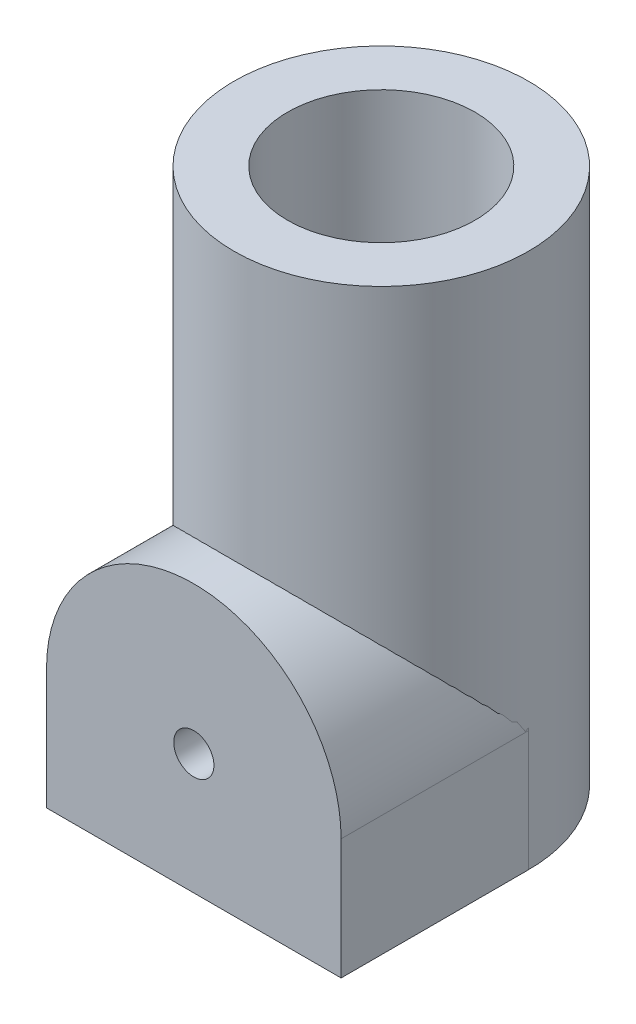
ISO-10303-21;
HEADER;
FILE_DESCRIPTION(('STEP AP214'),'2;1');
FILE_NAME('part.step','',(''),(''),'','','');
FILE_SCHEMA(('AUTOMOTIVE_DESIGN { 1 0 10303 214 1 1 1 1 }'));
ENDSEC;
DATA;
#1=APPLICATION_CONTEXT('core data for automotive mechanical design processes');
#2=APPLICATION_PROTOCOL_DEFINITION('international standard','automotive_design',2000,#1);
#3=PRODUCT_CONTEXT('',#1,'mechanical');
#4=PRODUCT('Part','Part','',(#3));
#5=PRODUCT_RELATED_PRODUCT_CATEGORY('part','',(#4));
#6=PRODUCT_DEFINITION_FORMATION('','',#4);
#7=PRODUCT_DEFINITION_CONTEXT('part definition',#1,'design');
#8=PRODUCT_DEFINITION('design','',#6,#7);
#9=PRODUCT_DEFINITION_SHAPE('','',#8);
#10=(LENGTH_UNIT() NAMED_UNIT(*) SI_UNIT(.MILLI.,.METRE.));
#11=(NAMED_UNIT(*) PLANE_ANGLE_UNIT() SI_UNIT($,.RADIAN.));
#12=(NAMED_UNIT(*) SI_UNIT($,.STERADIAN.) SOLID_ANGLE_UNIT());
#13=UNCERTAINTY_MEASURE_WITH_UNIT(LENGTH_MEASURE(1.E-05),#10,'distance_accuracy_value','');
#14=(GEOMETRIC_REPRESENTATION_CONTEXT(3) GLOBAL_UNCERTAINTY_ASSIGNED_CONTEXT((#13)) GLOBAL_UNIT_ASSIGNED_CONTEXT((#10,
#11,#12)) REPRESENTATION_CONTEXT('',''));
#15=CARTESIAN_POINT('',(0.,0.,0.));
#16=DIRECTION('',(0.,0.,1.));
#17=DIRECTION('',(1.,0.,0.));
#18=AXIS2_PLACEMENT_3D('',#15,#16,#17);
#19=CARTESIAN_POINT('',(0.,4.5,7.));
#20=DIRECTION('',(0.,0.,-1.));
#21=DIRECTION('',(-1.,0.,0.));
#22=AXIS2_PLACEMENT_3D('',#19,#20,#21);
#23=CYLINDRICAL_SURFACE('',#22,5.5);
#24=CARTESIAN_POINT('',(0.,4.5,0.));
#25=DIRECTION('',(0.,0.,1.));
#26=DIRECTION('',(1.,0.,0.));
#27=AXIS2_PLACEMENT_3D('',#24,#25,#26);
#28=CIRCLE('',#27,5.5);
#29=CARTESIAN_POINT('',(5.5,4.5,0.));
#30=VERTEX_POINT('',#29);
#31=CARTESIAN_POINT('',(-5.5,4.5,0.));
#32=VERTEX_POINT('',#31);
#33=EDGE_CURVE('E108',#30,#32,#28,.T.);
#34=ORIENTED_EDGE('',*,*,#33,.T.);
#35=DIRECTION('',(0.,0.,-1.));
#36=VECTOR('',#35,1.);
#37=CARTESIAN_POINT('',(-5.5,4.5,7.));
#38=LINE('',#37,#36);
#39=CARTESIAN_POINT('',(-5.5,4.5,7.));
#40=VERTEX_POINT('',#39);
#41=EDGE_CURVE('E12',#40,#32,#38,.T.);
#42=ORIENTED_EDGE('',*,*,#41,.F.);
#43=CARTESIAN_POINT('',(0.,4.5,7.));
#44=DIRECTION('',(0.,0.,1.));
#45=DIRECTION('',(1.,0.,0.));
#46=AXIS2_PLACEMENT_3D('',#43,#44,#45);
#47=CIRCLE('',#46,5.5);
#48=CARTESIAN_POINT('',(5.5,4.5,7.));
#49=VERTEX_POINT('',#48);
#50=EDGE_CURVE('E85',#49,#40,#47,.T.);
#51=ORIENTED_EDGE('',*,*,#50,.F.);
#52=DIRECTION('',(0.,0.,-1.));
#53=VECTOR('',#52,1.);
#54=CARTESIAN_POINT('',(5.5,4.5,7.));
#55=LINE('',#54,#53);
#56=EDGE_CURVE('E107',#49,#30,#55,.T.);
#57=ORIENTED_EDGE('',*,*,#56,.T.);
#58=EDGE_LOOP('',(#34,#42,#51,#57));
#59=FACE_BOUND('',#58,.T.);
#60=ADVANCED_FACE('F42',(#59),#23,.T.);
#61=CARTESIAN_POINT('',(-5.5,0.,7.));
#62=DIRECTION('',(-1.,0.,0.));
#63=DIRECTION('',(0.,0.,1.));
#64=AXIS2_PLACEMENT_3D('',#61,#62,#63);
#65=PLANE('',#64);
#66=DIRECTION('',(0.,1.,0.));
#67=VECTOR('',#66,1.);
#68=CARTESIAN_POINT('',(-5.5,0.,0.));
#69=LINE('',#68,#67);
#70=CARTESIAN_POINT('',(-5.5,0.,0.));
#71=VERTEX_POINT('',#70);
#72=EDGE_CURVE('E95',#71,#32,#69,.T.);
#73=ORIENTED_EDGE('',*,*,#72,.F.);
#74=DIRECTION('',(0.,0.,-1.));
#75=VECTOR('',#74,1.);
#76=CARTESIAN_POINT('',(-5.5,0.,7.));
#77=LINE('',#76,#75);
#78=CARTESIAN_POINT('',(-5.5,0.,7.));
#79=VERTEX_POINT('',#78);
#80=EDGE_CURVE('E51',#79,#71,#77,.T.);
#81=ORIENTED_EDGE('',*,*,#80,.F.);
#82=DIRECTION('',(0.,1.,0.));
#83=VECTOR('',#82,1.);
#84=CARTESIAN_POINT('',(-5.5,0.,7.));
#85=LINE('',#84,#83);
#86=EDGE_CURVE('E93',#79,#40,#85,.T.);
#87=ORIENTED_EDGE('',*,*,#86,.T.);
#88=ORIENTED_EDGE('',*,*,#41,.T.);
#89=EDGE_LOOP('',(#73,#81,#87,#88));
#90=FACE_BOUND('',#89,.T.);
#91=ADVANCED_FACE('F92',(#90),#65,.T.);
#92=CARTESIAN_POINT('',(0.,0.,7.));
#93=DIRECTION('',(0.,1.,0.));
#94=DIRECTION('',(0.,0.,1.));
#95=AXIS2_PLACEMENT_3D('',#92,#93,#94);
#96=PLANE('',#95);
#97=DIRECTION('',(1.,0.,0.));
#98=VECTOR('',#97,1.);
#99=CARTESIAN_POINT('',(0.,0.,0.));
#100=LINE('',#99,#98);
#101=CARTESIAN_POINT('',(5.5,0.,0.));
#102=VERTEX_POINT('',#101);
#103=EDGE_CURVE('E74',#71,#102,#100,.T.);
#104=ORIENTED_EDGE('',*,*,#103,.T.);
#105=DIRECTION('',(0.,0.,-1.));
#106=VECTOR('',#105,1.);
#107=CARTESIAN_POINT('',(5.5,0.,7.));
#108=LINE('',#107,#106);
#109=CARTESIAN_POINT('',(5.5,0.,7.));
#110=VERTEX_POINT('',#109);
#111=EDGE_CURVE('E96',#110,#102,#108,.T.);
#112=ORIENTED_EDGE('',*,*,#111,.F.);
#113=DIRECTION('',(1.,0.,0.));
#114=VECTOR('',#113,1.);
#115=CARTESIAN_POINT('',(0.,0.,7.));
#116=LINE('',#115,#114);
#117=EDGE_CURVE('E98',#79,#110,#116,.T.);
#118=ORIENTED_EDGE('',*,*,#117,.F.);
#119=ORIENTED_EDGE('',*,*,#80,.T.);
#120=EDGE_LOOP('',(#104,#112,#118,#119));
#121=FACE_BOUND('',#120,.T.);
#122=ADVANCED_FACE('F99',(#121),#96,.F.);
#123=CARTESIAN_POINT('',(5.5,0.,7.));
#124=DIRECTION('',(-1.,0.,0.));
#125=DIRECTION('',(0.,0.,1.));
#126=AXIS2_PLACEMENT_3D('',#123,#124,#125);
#127=PLANE('',#126);
#128=DIRECTION('',(0.,1.,0.));
#129=VECTOR('',#128,1.);
#130=CARTESIAN_POINT('',(5.5,0.,0.));
#131=LINE('',#130,#129);
#132=EDGE_CURVE('E80',#102,#30,#131,.T.);
#133=ORIENTED_EDGE('',*,*,#132,.T.);
#134=ORIENTED_EDGE('',*,*,#56,.F.);
#135=DIRECTION('',(0.,1.,0.));
#136=VECTOR('',#135,1.);
#137=CARTESIAN_POINT('',(5.5,0.,7.));
#138=LINE('',#137,#136);
#139=EDGE_CURVE('E59',#110,#49,#138,.T.);
#140=ORIENTED_EDGE('',*,*,#139,.F.);
#141=ORIENTED_EDGE('',*,*,#111,.T.);
#142=EDGE_LOOP('',(#133,#134,#140,#141));
#143=FACE_BOUND('',#142,.T.);
#144=ADVANCED_FACE('F115',(#143),#127,.F.);
#145=CARTESIAN_POINT('',(0.,0.,7.));
#146=DIRECTION('',(0.,0.,1.));
#147=DIRECTION('',(1.,0.,0.));
#148=AXIS2_PLACEMENT_3D('',#145,#146,#147);
#149=PLANE('',#148);
#150=CARTESIAN_POINT('',(0.,4.5,7.));
#151=DIRECTION('',(0.,0.,1.));
#152=DIRECTION('',(1.,0.,0.));
#153=AXIS2_PLACEMENT_3D('',#150,#151,#152);
#154=CIRCLE('',#153,0.75);
#155=CARTESIAN_POINT('',(0.749999999999999,4.5,7.));
#156=VERTEX_POINT('',#155);
#157=EDGE_CURVE('E146',#156,#156,#154,.T.);
#158=ORIENTED_EDGE('',*,*,#157,.F.);
#159=EDGE_LOOP('',(#158));
#160=FACE_BOUND('',#159,.T.);
#161=ORIENTED_EDGE('',*,*,#50,.T.);
#162=ORIENTED_EDGE('',*,*,#86,.F.);
#163=ORIENTED_EDGE('',*,*,#117,.T.);
#164=ORIENTED_EDGE('',*,*,#139,.T.);
#165=EDGE_LOOP('',(#161,#162,#163,#164));
#166=FACE_BOUND('',#165,.T.);
#167=ADVANCED_FACE('F101',(#160,#166),#149,.T.);
#168=CARTESIAN_POINT('',(0.,0.,0.));
#169=DIRECTION('',(0.,0.,1.));
#170=DIRECTION('',(1.,0.,0.));
#171=AXIS2_PLACEMENT_3D('',#168,#169,#170);
#172=PLANE('',#171);
#173=CARTESIAN_POINT('',(0.,4.5,0.));
#174=DIRECTION('',(0.,0.,1.));
#175=DIRECTION('',(1.,0.,0.));
#176=AXIS2_PLACEMENT_3D('',#173,#174,#175);
#177=CIRCLE('',#176,0.75);
#178=CARTESIAN_POINT('',(0.749999999999999,4.5,0.));
#179=VERTEX_POINT('',#178);
#180=EDGE_CURVE('E45',#179,#179,#177,.T.);
#181=ORIENTED_EDGE('',*,*,#180,.T.);
#182=EDGE_LOOP('',(#181));
#183=FACE_BOUND('',#182,.T.);
#184=ORIENTED_EDGE('',*,*,#33,.F.);
#185=ORIENTED_EDGE('',*,*,#132,.F.);
#186=ORIENTED_EDGE('',*,*,#103,.F.);
#187=ORIENTED_EDGE('',*,*,#72,.T.);
#188=EDGE_LOOP('',(#184,#185,#186,#187));
#189=FACE_BOUND('',#188,.T.);
#190=ADVANCED_FACE('F118',(#183,#189),#172,.F.);
#191=CARTESIAN_POINT('',(0.,4.5,-23.));
#192=DIRECTION('',(0.,0.,1.));
#193=DIRECTION('',(1.,0.,0.));
#194=AXIS2_PLACEMENT_3D('',#191,#192,#193);
#195=CYLINDRICAL_SURFACE('',#194,0.75);
#196=ORIENTED_EDGE('',*,*,#157,.T.);
#197=EDGE_LOOP('',(#196));
#198=FACE_BOUND('',#197,.T.);
#199=ORIENTED_EDGE('',*,*,#180,.F.);
#200=EDGE_LOOP('',(#199));
#201=FACE_BOUND('',#200,.T.);
#202=ADVANCED_FACE('F133',(#198,#201),#195,.F.);
#203=CLOSED_SHELL('',(#60,#91,#122,#144,#167,#190,#202));
#204=MANIFOLD_SOLID_BREP('B2',#203);
#205=CARTESIAN_POINT('',(0.,20.,0.));
#206=DIRECTION('',(0.,1.,0.));
#207=DIRECTION('',(0.,0.,1.));
#208=AXIS2_PLACEMENT_3D('',#205,#206,#207);
#209=PLANE('',#208);
#210=CARTESIAN_POINT('',(0.,20.,0.));
#211=DIRECTION('',(0.,1.,0.));
#212=DIRECTION('',(0.,0.,1.));
#213=AXIS2_PLACEMENT_3D('',#210,#211,#212);
#214=CIRCLE('',#213,5.5);
#215=CARTESIAN_POINT('',(0.,20.,5.5));
#216=VERTEX_POINT('',#215);
#217=EDGE_CURVE('E41',#216,#216,#214,.T.);
#218=ORIENTED_EDGE('',*,*,#217,.T.);
#219=EDGE_LOOP('',(#218));
#220=FACE_BOUND('',#219,.T.);
#221=CARTESIAN_POINT('',(0.,20.,0.));
#222=DIRECTION('',(0.,1.,0.));
#223=DIRECTION('',(0.,0.,1.));
#224=AXIS2_PLACEMENT_3D('',#221,#222,#223);
#225=CIRCLE('',#224,3.5);
#226=CARTESIAN_POINT('',(0.,20.,3.5));
#227=VERTEX_POINT('',#226);
#228=EDGE_CURVE('E222',#227,#227,#225,.T.);
#229=ORIENTED_EDGE('',*,*,#228,.F.);
#230=EDGE_LOOP('',(#229));
#231=FACE_BOUND('',#230,.T.);
#232=ADVANCED_FACE('F204',(#220,#231),#209,.T.);
#233=CARTESIAN_POINT('',(0.,0.,0.));
#234=DIRECTION('',(0.,1.,0.));
#235=DIRECTION('',(0.,0.,1.));
#236=AXIS2_PLACEMENT_3D('',#233,#234,#235);
#237=PLANE('',#236);
#238=CARTESIAN_POINT('',(0.,0.,0.));
#239=DIRECTION('',(0.,1.,0.));
#240=DIRECTION('',(0.,0.,1.));
#241=AXIS2_PLACEMENT_3D('',#238,#239,#240);
#242=CIRCLE('',#241,5.5);
#243=CARTESIAN_POINT('',(0.,0.,5.5));
#244=VERTEX_POINT('',#243);
#245=EDGE_CURVE('E217',#244,#244,#242,.T.);
#246=ORIENTED_EDGE('',*,*,#245,.F.);
#247=EDGE_LOOP('',(#246));
#248=FACE_BOUND('',#247,.T.);
#249=CARTESIAN_POINT('',(0.,0.,0.));
#250=DIRECTION('',(0.,1.,0.));
#251=DIRECTION('',(0.,0.,1.));
#252=AXIS2_PLACEMENT_3D('',#249,#250,#251);
#253=CIRCLE('',#252,3.5);
#254=CARTESIAN_POINT('',(0.,0.,3.5));
#255=VERTEX_POINT('',#254);
#256=EDGE_CURVE('E225',#255,#255,#253,.T.);
#257=ORIENTED_EDGE('',*,*,#256,.T.);
#258=EDGE_LOOP('',(#257));
#259=FACE_BOUND('',#258,.T.);
#260=ADVANCED_FACE('F258',(#248,#259),#237,.F.);
#261=CARTESIAN_POINT('',(0.,20.,0.));
#262=DIRECTION('',(0.,-1.,0.));
#263=DIRECTION('',(0.,0.,-1.));
#264=AXIS2_PLACEMENT_3D('',#261,#262,#263);
#265=CYLINDRICAL_SURFACE('',#264,5.5);
#266=CARTESIAN_POINT('',(0.,5.25,-5.5));
#267=CARTESIAN_POINT('',(-0.0419192067149303,5.24999824027131,-5.49999937336308));
#268=CARTESIAN_POINT('',(-0.0838638011448729,5.24647370366372,-5.49951571357438));
#269=CARTESIAN_POINT('',(-0.166583548820706,5.23247055838786,-5.49763283204225));
#270=CARTESIAN_POINT('',(-0.207357472829928,5.22198490027508,-5.49623268220049));
#271=CARTESIAN_POINT('',(-0.286526546846797,5.19437613307969,-5.49267438699144));
#272=CARTESIAN_POINT('',(-0.324923361226613,5.17725773039896,-5.49051677919596));
#273=CARTESIAN_POINT('',(-0.398292651224865,5.1368802377199,-5.48568286361148));
#274=CARTESIAN_POINT('',(-0.43326566442936,5.11362211387286,-5.48300663745028));
#275=CARTESIAN_POINT('',(-0.499028781906124,5.06146389285384,-5.47741429984626));
#276=CARTESIAN_POINT('',(-0.529793392311884,5.03253178849827,-5.47449688452611));
#277=CARTESIAN_POINT('',(-0.58604666954022,4.96991569460381,-5.4687613577966));
#278=CARTESIAN_POINT('',(-0.611535053063997,4.93623145006934,-5.46594325172624));
#279=CARTESIAN_POINT('',(-0.656609252624616,4.86489903088795,-5.46071268885941));
#280=CARTESIAN_POINT('',(-0.676170832342018,4.82723540749739,-5.45830191505401));
#281=CARTESIAN_POINT('',(-0.708681322426389,4.74911909231316,-5.45417647033879));
#282=CARTESIAN_POINT('',(-0.721630530539926,4.7086665261951,-5.45246176808648));
#283=CARTESIAN_POINT('',(-0.740470452775451,4.62638687821321,-5.44993524846084));
#284=CARTESIAN_POINT('',(-0.746404494322746,4.58456989035447,-5.44911789112245));
#285=CARTESIAN_POINT('',(-0.751179775298334,4.50052626348796,-5.44846171902411));
#286=CARTESIAN_POINT('',(-0.750021352489881,4.45829964408362,-5.44862285766541));
#287=CARTESIAN_POINT('',(-0.7406800850962,4.37493913719955,-5.44990040168278));
#288=CARTESIAN_POINT('',(-0.732545194587951,4.33379976181641,-5.45101028550982));
#289=CARTESIAN_POINT('',(-0.7095568384765,4.25347547973368,-5.4540500870409));
#290=CARTESIAN_POINT('',(-0.694703213251266,4.21429061949352,-5.45598002422751));
#291=CARTESIAN_POINT('',(-0.658648208801038,4.13884003698119,-5.4604497914685));
#292=CARTESIAN_POINT('',(-0.637426219288807,4.102584285366,-5.46299159637875));
#293=CARTESIAN_POINT('',(-0.589251615224103,4.03413042555711,-5.46839722167345));
#294=CARTESIAN_POINT('',(-0.562298689115209,4.00193253811663,-5.47126105956089));
#295=CARTESIAN_POINT('',(-0.503162638918999,3.94223022275271,-5.47701698694899));
#296=CARTESIAN_POINT('',(-0.470938225367116,3.91476667984379,-5.47990911470541));
#297=CARTESIAN_POINT('',(-0.402315472202706,3.86563175420081,-5.48537373528896));
#298=CARTESIAN_POINT('',(-0.365917119582321,3.84396038951848,-5.48794622711989));
#299=CARTESIAN_POINT('',(-0.289946484740226,3.80702406840998,-5.49248377043855));
#300=CARTESIAN_POINT('',(-0.250372816065645,3.79176192880364,-5.49444855474236));
#301=CARTESIAN_POINT('',(-0.169191543969949,3.7681110810272,-5.49754697601534));
#302=CARTESIAN_POINT('',(-0.127584054140067,3.75972198945326,-5.49868065934601));
#303=CARTESIAN_POINT('',(-0.0438694536838379,3.75010895771721,-5.49998306901876));
#304=CARTESIAN_POINT('',(-0.0017689181939235,3.7488287457057,-5.50015937345069));
#305=CARTESIAN_POINT('',(0.0820461470446251,3.75332093916537,-5.49954769385491));
#306=CARTESIAN_POINT('',(0.123760686590207,3.75909316514146,-5.49875973436916));
#307=CARTESIAN_POINT('',(0.205451689182471,3.77747961160483,-5.49631276328958));
#308=CARTESIAN_POINT('',(0.245434360310277,3.79006674778566,-5.4946572006166));
#309=CARTESIAN_POINT('',(0.322721570547791,3.82169737951646,-5.49066022031818));
#310=CARTESIAN_POINT('',(0.360026003212606,3.84074113150859,-5.48831877545155));
#311=CARTESIAN_POINT('',(0.431147446491228,3.88487876936201,-5.48319181518016));
#312=CARTESIAN_POINT('',(0.464941864176621,3.91000875140019,-5.4804036852855));
#313=CARTESIAN_POINT('',(0.527853506627301,3.96555478897868,-5.47470276571338));
#314=CARTESIAN_POINT('',(0.556970508726657,3.99597109602833,-5.47178997010962));
#315=CARTESIAN_POINT('',(0.609902664770561,4.0614754165042,-5.46614434386514));
#316=CARTESIAN_POINT('',(0.633680331903207,4.09659385674053,-5.46341287506068));
#317=CARTESIAN_POINT('',(0.674999197746325,4.17035915384988,-5.45846232522081));
#318=CARTESIAN_POINT('',(0.692540540980706,4.20900592892929,-5.45624323231173));
#319=CARTESIAN_POINT('',(0.720829247525762,4.28861387833659,-5.45257823630334));
#320=CARTESIAN_POINT('',(0.731597135250065,4.32956764721806,-5.45112999948602));
#321=CARTESIAN_POINT('',(0.74609905273759,4.41272326091402,-5.44916421580115));
#322=CARTESIAN_POINT('',(0.749833477489501,4.45492503550717,-5.44864661667047));
#323=CARTESIAN_POINT('',(0.750154282923589,4.53900548769548,-5.44860242707638));
#324=CARTESIAN_POINT('',(0.746799573453185,4.5808839483042,-5.44906766931026));
#325=CARTESIAN_POINT('',(0.733162732192666,4.66347556934924,-5.45091910026823));
#326=CARTESIAN_POINT('',(0.722880604355945,4.70418873045057,-5.45230528846675));
#327=CARTESIAN_POINT('',(0.6957002822524,4.78328256969257,-5.45583975409894));
#328=CARTESIAN_POINT('',(0.678805484903454,4.82166443374127,-5.45798764019647));
#329=CARTESIAN_POINT('',(0.638885199195598,4.89505814930318,-5.46280405562251));
#330=CARTESIAN_POINT('',(0.61585957682912,4.93006992713028,-5.46547259633115));
#331=CARTESIAN_POINT('',(0.564114576115415,4.99603001829989,-5.47105614960924));
#332=CARTESIAN_POINT('',(0.535351392117013,5.02694381811126,-5.47397295280181));
#333=CARTESIAN_POINT('',(0.473039934026811,5.08352767335539,-5.47970893651779));
#334=CARTESIAN_POINT('',(0.439490540978924,5.10919649915568,-5.48252809402078));
#335=CARTESIAN_POINT('',(0.368382746600999,5.15466298369168,-5.48776546484961));
#336=CARTESIAN_POINT('',(0.330806909258681,5.17443357913816,-5.49018180822811));
#337=CARTESIAN_POINT('',(0.252854846965158,5.20735474052649,-5.4943226852858));
#338=CARTESIAN_POINT('',(0.212481656010938,5.22051235484685,-5.49604795513862));
#339=CARTESIAN_POINT('',(0.143259298543595,5.23675521853197,-5.49820588033654));
#340=CARTESIAN_POINT('',(0.114842894348036,5.24171468039867,-5.49887532139432));
#341=CARTESIAN_POINT('',(0.0576216568234434,5.24833766049061,-5.49977259453692));
#342=CARTESIAN_POINT('',(0.0288168271488501,5.25000120970318,-5.5000004307736));
#343=CARTESIAN_POINT('',(0.,5.25,-5.5));
#344=B_SPLINE_CURVE_WITH_KNOTS('',3,(#266,#267,#268,#269,#270,#271,#272,#273,#274,#275,#276,
#277,#278,#279,#280,#281,#282,#283,#284,#285,#286,#287,#288,#289,#290,#291,#292,#293,#294,#295,
#296,#297,#298,#299,#300,#301,#302,#303,#304,#305,#306,#307,#308,#309,#310,#311,#312,#313,#314,
#315,#316,#317,#318,#319,#320,#321,#322,#323,#324,#325,#326,#327,#328,#329,#330,#331,#332,#333,
#334,#335,#336,#337,#338,#339,#340,#341,#342,#343),.UNSPECIFIED.,.T.,.F.,(4,2,2,2,2,2,2,2,2,2,2,
2,2,2,2,2,2,2,2,2,2,2,2,2,2,2,2,2,2,2,2,2,2,2,2,2,2,2,4),(0.,0.125652344043075,
0.251432129214746,0.377122827687659,0.502793759152625,0.629195129347516,0.755603284708058,
0.88252158963586,1.00943417909195,1.13555876000309,1.26167733455096,1.38693589436362,
1.51219743019437,1.63786881092517,1.76354702539777,1.8902614237342,2.01697621698005,
2.14374664255731,2.27050999593335,2.39626848102412,2.52202376544004,2.64728289404771,
2.77254699824741,2.89857303848946,3.02460507635877,3.15149607564704,3.27838413410365,
3.40488583002476,3.5313804215893,3.6568279937253,3.78227549426996,3.9076586370312,
4.0330445206421,4.15942711772184,4.28583931004705,4.41282291012338,4.53967087747129,
4.62604980031311,4.71242791103837),.UNSPECIFIED.);
#345=CARTESIAN_POINT('',(0.,5.25,-5.5));
#346=VERTEX_POINT('',#345);
#347=EDGE_CURVE('E248',#346,#346,#344,.T.);
#348=ORIENTED_EDGE('',*,*,#347,.T.);
#349=EDGE_LOOP('',(#348));
#350=FACE_BOUND('',#349,.T.);
#351=CARTESIAN_POINT('',(0.749999999999999,4.5,5.44862367942584));
#352=CARTESIAN_POINT('',(0.749998238494785,4.45808283605463,5.44862432821228));
#353=CARTESIAN_POINT('',(0.746474033793941,4.41614027861626,5.44911262094868));
#354=CARTESIAN_POINT('',(0.732472326567085,4.33342476265771,5.45101204241061));
#355=CARTESIAN_POINT('',(0.721987767323876,4.29265303498757,5.45242410767666));
#356=CARTESIAN_POINT('',(0.694382214066332,4.21348860724289,5.45600823054313));
#357=CARTESIAN_POINT('',(0.677265978501392,4.17509422420249,5.45817974310621));
#358=CARTESIAN_POINT('',(0.636893590754138,4.1017290156263,5.46303743390168));
#359=CARTESIAN_POINT('',(0.613638399485897,4.06675765546734,5.46572353156943));
#360=CARTESIAN_POINT('',(0.561483153875193,4.00099270250744,5.4713276859861));
#361=CARTESIAN_POINT('',(0.532550436012082,3.97022511983207,5.47424702406619));
#362=CARTESIAN_POINT('',(0.469931862967246,3.91396609715717,5.47997724063161));
#363=CARTESIAN_POINT('',(0.436245760944881,3.88847493132878,5.48278811347474));
#364=CARTESIAN_POINT('',(0.364911683410708,3.84339779755165,5.48799794558333));
#365=CARTESIAN_POINT('',(0.327248578727866,3.82383556171404,5.49039523330412));
#366=CARTESIAN_POINT('',(0.24913338990555,3.79132371594564,5.49449365219495));
#367=CARTESIAN_POINT('',(0.208681428253149,3.77837381580967,5.49619481391624));
#368=CARTESIAN_POINT('',(0.126403756906851,3.75953248401702,5.49870027402042));
#369=CARTESIAN_POINT('',(0.0845881563006051,3.75359765207428,5.49951008477627));
#370=CARTESIAN_POINT('',(0.000547254974663141,3.74882030951796,5.50016045400813));
#371=CARTESIAN_POINT('',(-0.0416780266531852,3.74997746997517,5.50000105743634));
#372=CARTESIAN_POINT('',(-0.125044033523873,3.7593167137932,5.49873540733172));
#373=CARTESIAN_POINT('',(-0.16619009747531,3.76745211475793,5.49763544605483));
#374=CARTESIAN_POINT('',(-0.246527492164895,3.79044380050787,5.49461929041563));
#375=CARTESIAN_POINT('',(-0.285718779877975,3.80530023315211,5.49270307809629));
#376=CARTESIAN_POINT('',(-0.361177250541708,3.84136110124492,5.48825888114084));
#377=CARTESIAN_POINT('',(-0.397434775412504,3.86258550039681,5.48572897741787));
#378=CARTESIAN_POINT('',(-0.465891164850841,3.91076527472651,5.48033997739526));
#379=CARTESIAN_POINT('',(-0.498089807977673,3.93772096237128,5.47748086315112));
#380=CARTESIAN_POINT('',(-0.557789097807127,3.99685900296016,5.47172549288364));
#381=CARTESIAN_POINT('',(-0.585249414208931,4.02908207375451,5.4688291238894));
#382=CARTESIAN_POINT('',(-0.634378465191472,4.09770097966841,5.46334851083836));
#383=CARTESIAN_POINT('',(-0.656047174820572,4.13409683276436,5.46076426812632));
#384=CARTESIAN_POINT('',(-0.692981572825317,4.2100667254005,5.4562005774764));
#385=CARTESIAN_POINT('',(-0.708243636178043,4.24964254919216,5.45422147211024));
#386=CARTESIAN_POINT('',(-0.731893674041884,4.33082851528622,5.45109853836437));
#387=CARTESIAN_POINT('',(-0.740282045433559,4.37243853998873,5.44995466175976));
#388=CARTESIAN_POINT('',(-0.749892354180297,4.45615442175345,5.44864067222812));
#389=CARTESIAN_POINT('',(-0.751171227137242,4.49825362580975,5.44846282324422));
#390=CARTESIAN_POINT('',(-0.746676830732749,4.58206570896659,5.44908053291778));
#391=CARTESIAN_POINT('',(-0.740903741107735,4.62377859788602,5.4498760667662));
#392=CARTESIAN_POINT('',(-0.722517388634435,4.70546086628945,5.45234382679086));
#393=CARTESIAN_POINT('',(-0.709932038780939,4.74543664637309,5.45401247449059));
#394=CARTESIAN_POINT('',(-0.678307280784333,4.82271086231487,5.45803552731522));
#395=CARTESIAN_POINT('',(-0.659267605550157,4.86000918729789,5.46038996081853));
#396=CARTESIAN_POINT('',(-0.615136060523289,4.93112630311135,5.46553770194495));
#397=CARTESIAN_POINT('',(-0.590007061362657,4.96492185806318,5.46833366386318));
#398=CARTESIAN_POINT('',(-0.534462296366746,5.02783625121716,5.4740412458354));
#399=CARTESIAN_POINT('',(-0.50404628483193,5.05695487195044,5.47695287125968));
#400=CARTESIAN_POINT('',(-0.43854129372568,5.10989076340468,5.48258766100113));
#401=CARTESIAN_POINT('',(-0.403421827621338,5.13367048223124,5.48530940289262));
#402=CARTESIAN_POINT('',(-0.329653908910435,5.1749929445194,5.49023614004829));
#403=CARTESIAN_POINT('',(-0.291005538775301,5.19253583369051,5.49244114738441));
#404=CARTESIAN_POINT('',(-0.211398404265972,5.22082551296426,5.49607969494058));
#405=CARTESIAN_POINT('',(-0.17044728588715,5.23159349682321,5.49751563888312));
#406=CARTESIAN_POINT('',(-0.0872972814052522,5.24609650383806,5.49946429827437));
#407=CARTESIAN_POINT('',(-0.045098462955508,5.24983190760982,5.4999770636871));
#408=CARTESIAN_POINT('',(0.0389834861984442,5.25015566638562,5.50002124174464));
#409=CARTESIAN_POINT('',(0.0808664021367494,5.24680172844135,5.4995605780852));
#410=CARTESIAN_POINT('',(0.163467131876105,5.2331648671807,5.49772550186329));
#411=CARTESIAN_POINT('',(0.204184947643067,5.22288195555651,5.4963510908427));
#412=CARTESIAN_POINT('',(0.283288469414656,5.19569820360217,5.49284222198332));
#413=CARTESIAN_POINT('',(0.321675328567205,5.17880066691755,5.49070814360522));
#414=CARTESIAN_POINT('',(0.39507789821285,5.13887334887975,5.4859154179771));
#415=CARTESIAN_POINT('',(0.43009353812658,5.11584343917809,5.48325675974811));
#416=CARTESIAN_POINT('',(0.496053682151112,5.06409360663878,5.47768532661291));
#417=CARTESIAN_POINT('',(0.526964442343851,5.03533086601973,5.47477073786026));
#418=CARTESIAN_POINT('',(0.583542371196154,4.97302156100457,5.46903000129061));
#419=CARTESIAN_POINT('',(0.609208302111161,4.93947387055676,5.46620387448299));
#420=CARTESIAN_POINT('',(0.654671533451963,4.86836757665697,5.46094615595882));
#421=CARTESIAN_POINT('',(0.674441285541155,4.83079122708564,5.45851643956207));
#422=CARTESIAN_POINT('',(0.707360730002457,4.75283810382503,5.45434859208448));
#423=CARTESIAN_POINT('',(0.720517480406805,4.71246436838562,5.45260972408102));
#424=CARTESIAN_POINT('',(0.736758008064997,4.64324430088055,5.45043388216463));
#425=CARTESIAN_POINT('',(0.741716419463798,4.61483089440159,5.44975853008097));
#426=CARTESIAN_POINT('',(0.748338004828135,4.55761565571886,5.44885320789077));
#427=CARTESIAN_POINT('',(0.750001210857373,4.52881382729735,5.44862323345052));
#428=CARTESIAN_POINT('',(0.749999999999999,4.5,5.44862367942584));
#429=B_SPLINE_CURVE_WITH_KNOTS('',3,(#351,#352,#353,#354,#355,#356,#357,#358,#359,#360,#361,
#362,#363,#364,#365,#366,#367,#368,#369,#370,#371,#372,#373,#374,#375,#376,#377,#378,#379,#380,
#381,#382,#383,#384,#385,#386,#387,#388,#389,#390,#391,#392,#393,#394,#395,#396,#397,#398,#399,
#400,#401,#402,#403,#404,#405,#406,#407,#408,#409,#410,#411,#412,#413,#414,#415,#416,#417,#418,
#419,#420,#421,#422,#423,#424,#425,#426,#427,#428),.UNSPECIFIED.,.T.,.F.,(4,2,2,2,2,2,2,2,2,2,2,
2,2,2,2,2,2,2,2,2,2,2,2,2,2,2,2,2,2,2,2,2,2,2,2,2,2,2,4),(0.,0.125646206826176,
0.251419994307372,0.377103701527231,0.502767747470545,0.629177150874043,0.755593121066162,
0.882508617622694,1.00941854357566,1.13553913352513,1.26165387399972,1.38693146536708,
1.51221181290698,1.63788909532179,1.7635732313566,1.8902793565586,2.01698602763231,
2.14376429583517,2.27053524346325,2.3962894818841,2.52204051521908,2.64728014611423,
2.77252496027315,2.89855356459823,3.02458802732691,3.15148298083583,3.27837496953451,
3.40486800549967,3.5313541952376,3.65681475740461,3.78227510786556,3.90767287748694,
4.03307327184753,4.15944795111646,4.28585241960836,4.41283854629708,4.53968885183256,
4.62605880130635,4.71242791036092),.UNSPECIFIED.);
#430=CARTESIAN_POINT('',(0.749999999999999,4.5,5.44862367942584));
#431=VERTEX_POINT('',#430);
#432=EDGE_CURVE('E244',#431,#431,#429,.T.);
#433=ORIENTED_EDGE('',*,*,#432,.T.);
#434=EDGE_LOOP('',(#433));
#435=FACE_BOUND('',#434,.T.);
#436=ORIENTED_EDGE('',*,*,#217,.F.);
#437=EDGE_LOOP('',(#436));
#438=FACE_BOUND('',#437,.T.);
#439=ORIENTED_EDGE('',*,*,#245,.T.);
#440=EDGE_LOOP('',(#439));
#441=FACE_BOUND('',#440,.T.);
#442=ADVANCED_FACE('F206',(#350,#435,#438,#441),#265,.T.);
#443=CARTESIAN_POINT('',(0.,20.,0.));
#444=DIRECTION('',(0.,-1.,0.));
#445=DIRECTION('',(0.,0.,-1.));
#446=AXIS2_PLACEMENT_3D('',#443,#444,#445);
#447=CYLINDRICAL_SURFACE('',#446,3.5);
#448=CARTESIAN_POINT('',(0.,5.25,-3.5));
#449=CARTESIAN_POINT('',(-0.0416179430453083,5.24999855021285,-3.49999923021613));
#450=CARTESIAN_POINT('',(-0.0832535978001372,5.24652419580607,-3.49925012974855));
#451=CARTESIAN_POINT('',(-0.165343672146664,5.2327321715732,-3.49633414913864));
#452=CARTESIAN_POINT('',(-0.205797201785595,5.22240947790253,-3.4941662281855));
#453=CARTESIAN_POINT('',(-0.284324661908868,5.19525781769598,-3.48865415894413));
#454=CARTESIAN_POINT('',(-0.322400981723278,5.17843551030934,-3.48531121483585));
#455=CARTESIAN_POINT('',(-0.395189088980394,5.13878295691437,-3.47781053408985));
#456=CARTESIAN_POINT('',(-0.429900990873685,5.11595291537503,-3.4736528251833));
#457=CARTESIAN_POINT('',(-0.495512395267615,5.06455985016325,-3.46490684623155));
#458=CARTESIAN_POINT('',(-0.526352517097226,5.03592188905074,-3.4603134157163));
#459=CARTESIAN_POINT('',(-0.582830211947175,4.9738868421574,-3.45125034907072));
#460=CARTESIAN_POINT('',(-0.608467335754541,4.94048934587437,-3.44678072365815));
#461=CARTESIAN_POINT('',(-0.654071021899043,4.86944712356978,-3.43842058023612));
#462=CARTESIAN_POINT('',(-0.673974791675044,4.8317612411219,-3.4345366817218));
#463=CARTESIAN_POINT('',(-0.707144118455738,4.75348277311658,-3.42786162779268));
#464=CARTESIAN_POINT('',(-0.720410435008579,4.71289052075371,-3.42507034735355));
#465=CARTESIAN_POINT('',(-0.739732872112273,4.63059445670596,-3.42094904463155));
#466=CARTESIAN_POINT('',(-0.745893898741713,4.58891636216807,-3.41959778448243));
#467=CARTESIAN_POINT('',(-0.751156976032886,4.5050978837465,-3.41844569922553));
#468=CARTESIAN_POINT('',(-0.750259858323148,4.46295755491003,-3.41864469145864));
#469=CARTESIAN_POINT('',(-0.741516631704308,4.38018765603311,-3.42055138301916));
#470=CARTESIAN_POINT('',(-0.733791993247042,4.33954455544992,-3.42223270841081));
#471=CARTESIAN_POINT('',(-0.711805271493385,4.26014487985533,-3.42687296687894));
#472=CARTESIAN_POINT('',(-0.697542834682329,4.22138840698384,-3.42983196904201));
#473=CARTESIAN_POINT('',(-0.662772755379957,4.14651856356333,-3.43672040377862));
#474=CARTESIAN_POINT('',(-0.64221805486415,4.11042774364373,-3.44065710491682));
#475=CARTESIAN_POINT('',(-0.595480036419967,4.04216241752102,-3.44905286250644));
#476=CARTESIAN_POINT('',(-0.569295980517812,4.0099884256569,-3.45351198740948));
#477=CARTESIAN_POINT('',(-0.511397713776603,3.9497703221633,-3.46256359196939));
#478=CARTESIAN_POINT('',(-0.479580116982207,3.92182564670763,-3.46715691986089));
#479=CARTESIAN_POINT('',(-0.41165865313455,3.87165313315517,-3.4758750874853));
#480=CARTESIAN_POINT('',(-0.375554714387701,3.84942539069981,-3.47999991937986));
#481=CARTESIAN_POINT('',(-0.299966731024981,3.81129466004654,-3.48732889267001));
#482=CARTESIAN_POINT('',(-0.260476129431743,3.79540429371101,-3.49053119321677));
#483=CARTESIAN_POINT('',(-0.179301573342855,3.77051217583946,-3.49564054622667));
#484=CARTESIAN_POINT('',(-0.137617925566836,3.76150946371834,-3.49754777930192));
#485=CARTESIAN_POINT('',(-0.0540938354183162,3.75079189292829,-3.49982653173904));
#486=CARTESIAN_POINT('',(-0.0122715886358089,3.74894114355911,-3.50022668260533));
#487=CARTESIAN_POINT('',(0.0710844868252009,3.75221228556258,-3.49952624467985));
#488=CARTESIAN_POINT('',(0.112618334063626,3.75733372398147,-3.49842575337849));
#489=CARTESIAN_POINT('',(0.193771268991401,3.77429112183085,-3.49486571522633));
#490=CARTESIAN_POINT('',(0.233405856454237,3.78605618473627,-3.4924205252273));
#491=CARTESIAN_POINT('',(0.310139225236707,3.81588847149741,-3.48644462210755));
#492=CARTESIAN_POINT('',(0.347237796293868,3.83395621715583,-3.48291381911119));
#493=CARTESIAN_POINT('',(0.418410698982375,3.87616677153016,-3.475087521952));
#494=CARTESIAN_POINT('',(0.452436287555569,3.90038989745486,-3.47078215677137));
#495=CARTESIAN_POINT('',(0.515988462761796,3.95411741244437,-3.46190516517424));
#496=CARTESIAN_POINT('',(0.545514489345996,3.98362245794372,-3.45733350571049));
#497=CARTESIAN_POINT('',(0.599763555289944,4.04769868509357,-3.44834086353162));
#498=CARTESIAN_POINT('',(0.624392686275781,4.08235004961105,-3.44392396110642));
#499=CARTESIAN_POINT('',(0.667482076930201,4.155377298239,-3.4358332727984));
#500=CARTESIAN_POINT('',(0.685942599568527,4.19375302348875,-3.43215945524027));
#501=CARTESIAN_POINT('',(0.716048706242738,4.2729361494973,-3.42600504903695));
#502=CARTESIAN_POINT('',(0.727731993206374,4.31372867821533,-3.42351787291483));
#503=CARTESIAN_POINT('',(0.744063480426676,4.39675779191682,-3.42000593354209));
#504=CARTESIAN_POINT('',(0.748712753901287,4.43899415560066,-3.41898094719853));
#505=CARTESIAN_POINT('',(0.750799999630201,4.52276617158762,-3.41852309424078));
#506=CARTESIAN_POINT('',(0.748386736291555,4.56429800749029,-3.41905738259272));
#507=CARTESIAN_POINT('',(0.736748947031652,4.64634862106629,-3.42158381592415));
#508=CARTESIAN_POINT('',(0.727524494789894,4.68686740969329,-3.42357594513357));
#509=CARTESIAN_POINT('',(0.702596729702168,4.76562932893458,-3.42877790552079));
#510=CARTESIAN_POINT('',(0.686914235854433,4.80387932433215,-3.43198382112352));
#511=CARTESIAN_POINT('',(0.649533757978003,4.87722768625342,-3.43925382295325));
#512=CARTESIAN_POINT('',(0.627835176507498,4.91232573930752,-3.44331799440181));
#513=CARTESIAN_POINT('',(0.578541451746518,4.97910909686268,-3.45194527796616));
#514=CARTESIAN_POINT('',(0.550839937106183,5.01071484797349,-3.45651654969463));
#515=CARTESIAN_POINT('',(0.49054327730981,5.06887813126023,-3.46558724899847));
#516=CARTESIAN_POINT('',(0.457947004692798,5.0954344971561,-3.47008665975648));
#517=CARTESIAN_POINT('',(0.388301573634358,5.14305797975278,-3.47857245524494));
#518=CARTESIAN_POINT('',(0.35120242300482,5.16405330311549,-3.48255182285313));
#519=CARTESIAN_POINT('',(0.273925080470299,5.19947726445309,-3.48947913052009));
#520=CARTESIAN_POINT('',(0.23374955293194,5.21391151129252,-3.49242795106171));
#521=CARTESIAN_POINT('',(0.161267608776602,5.23317609256558,-3.49642424230886));
#522=CARTESIAN_POINT('',(0.129358602772989,5.23947321699002,-3.49775695944132));
#523=CARTESIAN_POINT('',(0.064969980426923,5.24788565085583,-3.4995451207736));
#524=CARTESIAN_POINT('',(0.0324903875443724,5.25000113182303,-3.50000060095657));
#525=CARTESIAN_POINT('',(0.,5.25,-3.5));
#526=B_SPLINE_CURVE_WITH_KNOTS('',3,(#448,#449,#450,#451,#452,#453,#454,#455,#456,#457,#458,
#459,#460,#461,#462,#463,#464,#465,#466,#467,#468,#469,#470,#471,#472,#473,#474,#475,#476,#477,
#478,#479,#480,#481,#482,#483,#484,#485,#486,#487,#488,#489,#490,#491,#492,#493,#494,#495,#496,
#497,#498,#499,#500,#501,#502,#503,#504,#505,#506,#507,#508,#509,#510,#511,#512,#513,#514,#515,
#516,#517,#518,#519,#520,#521,#522,#523,#524,#525),.UNSPECIFIED.,.T.,.F.,(4,2,2,2,2,2,2,2,2,2,2,
2,2,2,2,2,2,2,2,2,2,2,2,2,2,2,2,2,2,2,2,2,2,2,2,2,2,2,4),(0.,0.124734918256041,
0.249561441609968,0.374260412212801,0.498955139322943,0.625374809408661,0.751805389592532,
0.879572146072552,1.00732427838745,1.13316504062333,1.25899097584582,1.38262237726464,
1.50626046452284,1.63084678082984,1.75544943960445,1.88263505525145,2.00982279851175,
2.13726260569903,2.26468463628172,2.38967332852092,2.51465390115715,2.63832530294634,
2.76200694599217,2.88739366933901,3.01279598652242,3.14041031641767,3.26801920537903,
3.39491120204237,3.52178383614593,3.64600340270147,3.77022162554135,3.89404249853393,
4.01787567225811,4.14411475077057,4.27038295198557,4.39820955178611,4.52592667005135,
4.62330899566147,4.72068732668668),.UNSPECIFIED.);
#527=CARTESIAN_POINT('',(0.,5.25,-3.5));
#528=VERTEX_POINT('',#527);
#529=EDGE_CURVE('E209',#528,#528,#526,.T.);
#530=ORIENTED_EDGE('',*,*,#529,.F.);
#531=EDGE_LOOP('',(#530));
#532=FACE_BOUND('',#531,.T.);
#533=CARTESIAN_POINT('',(0.749999999999999,4.5,3.41869858279434));
#534=CARTESIAN_POINT('',(0.749998541194087,4.45839442376638,3.41869942294351));
#535=CARTESIAN_POINT('',(0.746526181228761,4.41677111305177,3.41946636233665));
#536=CARTESIAN_POINT('',(0.732742796269728,4.33470666390028,3.42244589278789));
#537=CARTESIAN_POINT('',(0.722426698268707,4.29426642566613,3.42465955623036));
#538=CARTESIAN_POINT('',(0.695294318421271,4.21576712520541,3.43027057629631));
#539=CARTESIAN_POINT('',(0.678485004956109,4.17770556093726,3.43366666358336));
#540=CARTESIAN_POINT('',(0.638863088367165,4.1049423630297,3.44125835428899));
#541=CARTESIAN_POINT('',(0.616050660244003,4.070240631486,3.44545393440007));
#542=CARTESIAN_POINT('',(0.564675712850977,4.00461851925839,3.45424789397074));
#543=CARTESIAN_POINT('',(0.536034297419879,3.97376056187987,3.45885124935541));
#544=CARTESIAN_POINT('',(0.473984754064822,3.91724822279726,3.46789845855534));
#545=CARTESIAN_POINT('',(0.440576265108846,3.89159423557001,3.47234230025799));
#546=CARTESIAN_POINT('',(0.369523644232281,3.84597227775424,3.48062384554625));
#547=CARTESIAN_POINT('',(0.331840244114973,3.82606417211468,3.4844549940969));
#548=CARTESIAN_POINT('',(0.253567134671299,3.79288615427687,3.49102335521491));
#549=CARTESIAN_POINT('',(0.212977738690156,3.77961552760686,3.49376068551671));
#550=CARTESIAN_POINT('',(0.130693593835754,3.76028501453433,3.49779782640584));
#551=CARTESIAN_POINT('',(0.0890247002984608,3.75411953572379,3.49911866689191));
#552=CARTESIAN_POINT('',(0.00522447265332181,3.74884436134337,3.50024681103503));
#553=CARTESIAN_POINT('',(-0.0369068100823803,3.74973388971962,3.5000542811635));
#554=CARTESIAN_POINT('',(-0.119708514625257,3.75846448233179,3.49819350431279));
#555=CARTESIAN_POINT('',(-0.160391557681057,3.76619175014496,3.49654941576216));
#556=CARTESIAN_POINT('',(-0.239869731989195,3.78819734092593,3.49199770794552));
#557=CARTESIAN_POINT('',(-0.278664780087528,3.80247595214987,3.48909003308259));
#558=CARTESIAN_POINT('',(-0.353583748778277,3.83728072944426,3.48229877323429));
#559=CARTESIAN_POINT('',(-0.389686828507895,3.85785038360217,3.47840842901973));
#560=CARTESIAN_POINT('',(-0.457970463281424,3.9046209840818,3.47007896871933));
#561=CARTESIAN_POINT('',(-0.490150503225765,3.93082266865015,3.46563978072347));
#562=CARTESIAN_POINT('',(-0.550351044000991,3.98873427226393,3.45659663230462));
#563=CARTESIAN_POINT('',(-0.578275586601253,4.02054378967852,3.45199115186426));
#564=CARTESIAN_POINT('',(-0.628411216173641,4.08844164253425,3.44321783415987));
#565=CARTESIAN_POINT('',(-0.650622160590342,4.12453008470262,3.43905000781693));
#566=CARTESIAN_POINT('',(-0.688740387866483,4.20011225053188,3.43162011793361));
#567=CARTESIAN_POINT('',(-0.704630175444614,4.23961506192622,3.42836057563888));
#568=CARTESIAN_POINT('',(-0.729517475795578,4.32081638297322,3.42315170403308));
#569=CARTESIAN_POINT('',(-0.73851603347314,4.3625145587216,3.42120217609241));
#570=CARTESIAN_POINT('',(-0.749217930123261,4.44604787632486,3.41887440627723));
#571=CARTESIAN_POINT('',(-0.751060709643201,4.48786433753865,3.41846613525851));
#572=CARTESIAN_POINT('',(-0.747775698211868,4.57120699659085,3.41918619786997));
#573=CARTESIAN_POINT('',(-0.742648365408177,4.61273321332678,3.42031443050531));
#574=CARTESIAN_POINT('',(-0.725689473177922,4.69383521749038,3.42395207742103));
#575=CARTESIAN_POINT('',(-0.713934151257768,4.73342771629848,3.42644577637182));
#576=CARTESIAN_POINT('',(-0.684135264733748,4.81008116876646,3.43251929934888));
#577=CARTESIAN_POINT('',(-0.666091118314092,4.8471418878171,3.43609922386424));
#578=CARTESIAN_POINT('',(-0.623917522083526,4.91828484237946,3.44400817040173));
#579=CARTESIAN_POINT('',(-0.599701842953962,4.95231479100609,3.44834750873158));
#580=CARTESIAN_POINT('',(-0.545985919168004,5.0158791729369,3.4572588768007));
#581=CARTESIAN_POINT('',(-0.516485045910806,5.04541307072423,3.46183093417231));
#582=CARTESIAN_POINT('',(-0.452406382210408,5.09968515147238,3.47079119995087));
#583=CARTESIAN_POINT('',(-0.417747462914386,5.12432845807851,3.47517467803873));
#584=CARTESIAN_POINT('',(-0.344700740641139,5.16744270467553,3.48317805357451));
#585=CARTESIAN_POINT('',(-0.30631310802187,5.18591392648642,3.48679798588346));
#586=CARTESIAN_POINT('',(-0.227132709491021,5.21602602731924,3.49284639190787));
#587=CARTESIAN_POINT('',(-0.186356596537587,5.22770915187314,3.49528221901849));
#588=CARTESIAN_POINT('',(-0.103362588501645,5.24404585286616,3.4987196965099));
#589=CARTESIAN_POINT('',(-0.0611448949869974,5.24870040798696,3.49972154656148));
#590=CARTESIAN_POINT('',(0.0226318585264136,5.25080532620593,3.50017255504528));
#591=CARTESIAN_POINT('',(0.0641872527546138,5.24839757930231,3.49965229500834));
#592=CARTESIAN_POINT('',(0.146286469207979,5.23676261824048,3.49718276181691));
#593=CARTESIAN_POINT('',(0.186830308202642,5.22753551721084,3.49523351236842));
#594=CARTESIAN_POINT('',(0.265650974243634,5.20259059687526,3.49012694319269));
#595=CARTESIAN_POINT('',(0.303934182536588,5.18689215530722,3.48697323215248));
#596=CARTESIAN_POINT('',(0.377342478361609,5.14946936441544,3.47979518025329));
#597=CARTESIAN_POINT('',(0.412467272398069,5.12774445584698,3.47577075860164));
#598=CARTESIAN_POINT('',(0.479256153447621,5.07841884062867,3.46719904967253));
#599=CARTESIAN_POINT('',(0.510845182552887,5.05071792083935,3.4626435445396));
#600=CARTESIAN_POINT('',(0.56897500728821,4.99042969487482,3.45356845037895));
#601=CARTESIAN_POINT('',(0.595514590312102,4.95784121832218,3.44904887022754));
#602=CARTESIAN_POINT('',(0.64311630798338,4.88820475340718,3.44049346826046));
#603=CARTESIAN_POINT('',(0.664104489048103,4.85110532085657,3.43646452978599));
#604=CARTESIAN_POINT('',(0.6995150232991,4.77382813953829,3.42943248613692));
#605=CARTESIAN_POINT('',(0.713943032119567,4.73365307737316,3.42642849789546));
#606=CARTESIAN_POINT('',(0.733193035607851,4.6611869344073,3.42235280321944));
#607=CARTESIAN_POINT('',(0.739483762538931,4.62929416214686,3.42099141547116));
#608=CARTESIAN_POINT('',(0.747887720216969,4.56493784421057,3.41916399749064));
#609=CARTESIAN_POINT('',(0.750001138639107,4.53247432424298,3.41869792703424));
#610=CARTESIAN_POINT('',(0.749999999999999,4.5,3.41869858279434));
#611=B_SPLINE_CURVE_WITH_KNOTS('',3,(#533,#534,#535,#536,#537,#538,#539,#540,#541,#542,#543,
#544,#545,#546,#547,#548,#549,#550,#551,#552,#553,#554,#555,#556,#557,#558,#559,#560,#561,#562,
#563,#564,#565,#566,#567,#568,#569,#570,#571,#572,#573,#574,#575,#576,#577,#578,#579,#580,#581,
#582,#583,#584,#585,#586,#587,#588,#589,#590,#591,#592,#593,#594,#595,#596,#597,#598,#599,#600,
#601,#602,#603,#604,#605,#606,#607,#608,#609,#610),.UNSPECIFIED.,.T.,.F.,(4,2,2,2,2,2,2,2,2,2,2,
2,2,2,2,2,2,2,2,2,2,2,2,2,2,2,2,2,2,2,2,2,2,2,2,2,2,2,4),(0.,0.124697741002727,
0.249488019218576,0.374144745554974,0.498797838346236,0.625266147892055,0.751744040542987,
0.879495674079986,1.00723355320993,1.13304754073824,1.2588476888648,1.38259278831545,
1.50634333301651,1.63096944069578,1.75561189434017,1.88274480387507,2.00988088509405,
2.1373664370375,2.26483265474779,2.38980216594121,2.51476346324818,2.63831590372547,
2.76187977779434,2.88727505106018,3.01268524827398,3.14033107339464,3.2679710693563,
3.39480794910047,3.52162716602129,3.64591599819923,3.77020276855409,3.89412004807601,
4.01804883073542,4.14424457078342,4.27047057813476,4.39830190081484,4.52602280803703,
4.62335728058995,4.72068738006871),.UNSPECIFIED.);
#612=CARTESIAN_POINT('',(0.749999999999999,4.5,3.41869858279434));
#613=VERTEX_POINT('',#612);
#614=EDGE_CURVE('E227',#613,#613,#611,.T.);
#615=ORIENTED_EDGE('',*,*,#614,.F.);
#616=EDGE_LOOP('',(#615));
#617=FACE_BOUND('',#616,.T.);
#618=ORIENTED_EDGE('',*,*,#228,.T.);
#619=EDGE_LOOP('',(#618));
#620=FACE_BOUND('',#619,.T.);
#621=ORIENTED_EDGE('',*,*,#256,.F.);
#622=EDGE_LOOP('',(#621));
#623=FACE_BOUND('',#622,.T.);
#624=ADVANCED_FACE('F231',(#532,#617,#620,#623),#447,.F.);
#625=CARTESIAN_POINT('',(0.,4.5,-23.));
#626=DIRECTION('',(0.,0.,1.));
#627=DIRECTION('',(1.,0.,0.));
#628=AXIS2_PLACEMENT_3D('',#625,#626,#627);
#629=CYLINDRICAL_SURFACE('',#628,0.75);
#630=ORIENTED_EDGE('',*,*,#614,.T.);
#631=EDGE_LOOP('',(#630));
#632=FACE_BOUND('',#631,.T.);
#633=ORIENTED_EDGE('',*,*,#432,.F.);
#634=EDGE_LOOP('',(#633));
#635=FACE_BOUND('',#634,.T.);
#636=ADVANCED_FACE('F237',(#632,#635),#629,.F.);
#637=ORIENTED_EDGE('',*,*,#529,.T.);
#638=EDGE_LOOP('',(#637));
#639=FACE_BOUND('',#638,.T.);
#640=ORIENTED_EDGE('',*,*,#347,.F.);
#641=EDGE_LOOP('',(#640));
#642=FACE_BOUND('',#641,.T.);
#643=ADVANCED_FACE('F234',(#639,#642),#629,.F.);
#644=CLOSED_SHELL('',(#232,#260,#442,#624,#636,#643));
#645=MANIFOLD_SOLID_BREP('B6',#644);
#646=ADVANCED_BREP_SHAPE_REPRESENTATION('',(#18,#204,#645),#14);
#647=SHAPE_DEFINITION_REPRESENTATION(#9,#646);
ENDSEC;
END-ISO-10303-21;
